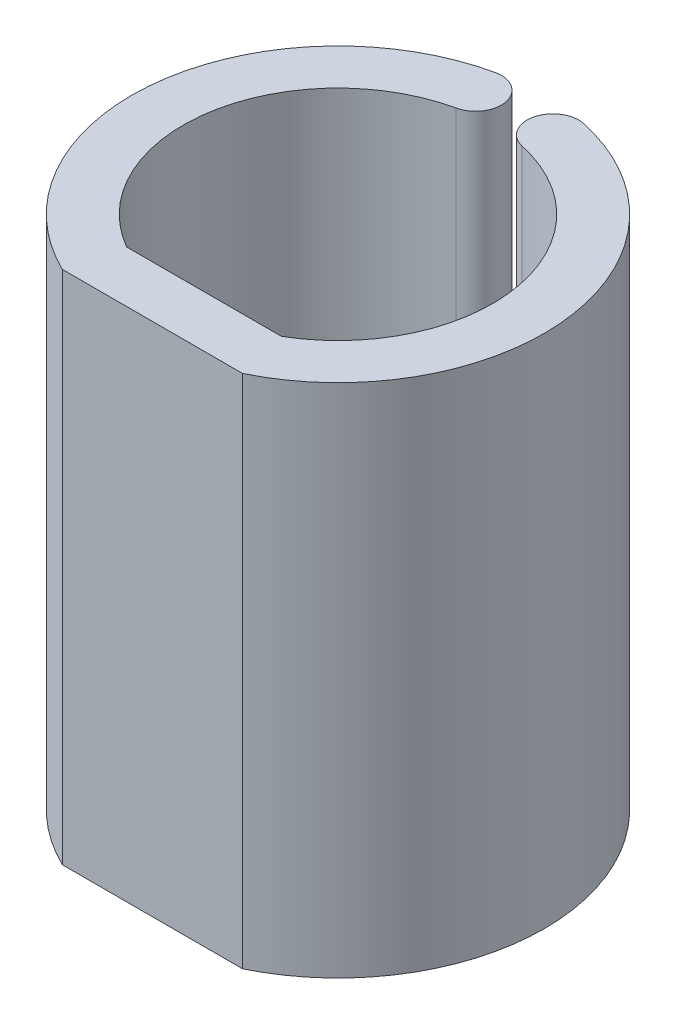
ISO-10303-21;
HEADER;
FILE_DESCRIPTION(('STEP AP214'),'2;1');
FILE_NAME('part.step','',(''),(''),'','','');
FILE_SCHEMA(('AUTOMOTIVE_DESIGN { 1 0 10303 214 1 1 1 1 }'));
ENDSEC;
DATA;
#1=APPLICATION_CONTEXT('core data for automotive mechanical design processes');
#2=APPLICATION_PROTOCOL_DEFINITION('international standard','automotive_design',2000,#1);
#3=PRODUCT_CONTEXT('',#1,'mechanical');
#4=PRODUCT('Part','Part','',(#3));
#5=PRODUCT_RELATED_PRODUCT_CATEGORY('part','',(#4));
#6=PRODUCT_DEFINITION_FORMATION('','',#4);
#7=PRODUCT_DEFINITION_CONTEXT('part definition',#1,'design');
#8=PRODUCT_DEFINITION('design','',#6,#7);
#9=PRODUCT_DEFINITION_SHAPE('','',#8);
#10=(LENGTH_UNIT() NAMED_UNIT(*) SI_UNIT(.MILLI.,.METRE.));
#11=(NAMED_UNIT(*) PLANE_ANGLE_UNIT() SI_UNIT($,.RADIAN.));
#12=(NAMED_UNIT(*) SI_UNIT($,.STERADIAN.) SOLID_ANGLE_UNIT());
#13=UNCERTAINTY_MEASURE_WITH_UNIT(LENGTH_MEASURE(1.E-05),#10,'distance_accuracy_value','');
#14=(GEOMETRIC_REPRESENTATION_CONTEXT(3) GLOBAL_UNCERTAINTY_ASSIGNED_CONTEXT((#13)) GLOBAL_UNIT_ASSIGNED_CONTEXT((#10,
#11,#12)) REPRESENTATION_CONTEXT('',''));
#15=CARTESIAN_POINT('',(0.,0.,0.));
#16=DIRECTION('',(0.,0.,1.));
#17=DIRECTION('',(1.,0.,0.));
#18=AXIS2_PLACEMENT_3D('',#15,#16,#17);
#19=CARTESIAN_POINT('',(0.,5.,-2.59807621135332));
#20=DIRECTION('',(0.,-1.,0.));
#21=DIRECTION('',(0.,0.,-1.));
#22=AXIS2_PLACEMENT_3D('',#19,#20,#21);
#23=CYLINDRICAL_SURFACE('',#22,3.);
#24=CARTESIAN_POINT('',(0.,-5.,-2.59807621135332));
#25=DIRECTION('',(0.,-1.,0.));
#26=DIRECTION('',(0.,0.,-1.));
#27=AXIS2_PLACEMENT_3D('',#24,#25,#26);
#28=CIRCLE('',#27,3.);
#29=CARTESIAN_POINT('',(-1.5,-5.,0.));
#30=VERTEX_POINT('',#29);
#31=CARTESIAN_POINT('',(-0.642857142857142,-5.,-5.52838928231989));
#32=VERTEX_POINT('',#31);
#33=EDGE_CURVE('E146',#30,#32,#28,.T.);
#34=ORIENTED_EDGE('',*,*,#33,.T.);
#35=DIRECTION('',(0.,-1.,0.));
#36=VECTOR('',#35,1.);
#37=CARTESIAN_POINT('',(-0.642857142857142,5.,-5.52838928231989));
#38=LINE('',#37,#36);
#39=CARTESIAN_POINT('',(-0.642857142857142,5.,-5.52838928231989));
#40=VERTEX_POINT('',#39);
#41=EDGE_CURVE('E11',#40,#32,#38,.T.);
#42=ORIENTED_EDGE('',*,*,#41,.F.);
#43=CARTESIAN_POINT('',(0.,5.,-2.59807621135332));
#44=DIRECTION('',(0.,-1.,0.));
#45=DIRECTION('',(0.,0.,-1.));
#46=AXIS2_PLACEMENT_3D('',#43,#44,#45);
#47=CIRCLE('',#46,3.);
#48=CARTESIAN_POINT('',(-1.5,5.,0.));
#49=VERTEX_POINT('',#48);
#50=EDGE_CURVE('E168',#49,#40,#47,.T.);
#51=ORIENTED_EDGE('',*,*,#50,.F.);
#52=DIRECTION('',(0.,-1.,0.));
#53=VECTOR('',#52,1.);
#54=CARTESIAN_POINT('',(-1.5,5.,0.));
#55=LINE('',#54,#53);
#56=EDGE_CURVE('E142',#49,#30,#55,.T.);
#57=ORIENTED_EDGE('',*,*,#56,.T.);
#58=EDGE_LOOP('',(#34,#42,#51,#57));
#59=FACE_BOUND('',#58,.T.);
#60=ADVANCED_FACE('F45',(#59),#23,.F.);
#61=CARTESIAN_POINT('',(-0.750000000000001,5.,-6.01677479414765));
#62=DIRECTION('',(0.,-1.,0.));
#63=DIRECTION('',(0.,0.,-1.));
#64=AXIS2_PLACEMENT_3D('',#61,#62,#63);
#65=CYLINDRICAL_SURFACE('',#64,0.5);
#66=CARTESIAN_POINT('',(-0.750000000000001,-5.,-6.01677479414765));
#67=DIRECTION('',(0.,1.,0.));
#68=DIRECTION('',(0.,0.,-1.));
#69=AXIS2_PLACEMENT_3D('',#66,#67,#68);
#70=CIRCLE('',#69,0.5);
#71=CARTESIAN_POINT('',(-0.857142857142859,-5.,-6.50516030597541));
#72=VERTEX_POINT('',#71);
#73=EDGE_CURVE('E150',#32,#72,#70,.T.);
#74=ORIENTED_EDGE('',*,*,#73,.T.);
#75=DIRECTION('',(0.,-1.,0.));
#76=VECTOR('',#75,1.);
#77=CARTESIAN_POINT('',(-0.857142857142859,5.,-6.50516030597541));
#78=LINE('',#77,#76);
#79=CARTESIAN_POINT('',(-0.857142857142859,5.,-6.50516030597541));
#80=VERTEX_POINT('',#79);
#81=EDGE_CURVE('E54',#80,#72,#78,.T.);
#82=ORIENTED_EDGE('',*,*,#81,.F.);
#83=CARTESIAN_POINT('',(-0.750000000000001,5.,-6.01677479414765));
#84=DIRECTION('',(0.,1.,0.));
#85=DIRECTION('',(0.,0.,-1.));
#86=AXIS2_PLACEMENT_3D('',#83,#84,#85);
#87=CIRCLE('',#86,0.5);
#88=EDGE_CURVE('E105',#40,#80,#87,.T.);
#89=ORIENTED_EDGE('',*,*,#88,.F.);
#90=ORIENTED_EDGE('',*,*,#41,.T.);
#91=EDGE_LOOP('',(#74,#82,#89,#90));
#92=FACE_BOUND('',#91,.T.);
#93=ADVANCED_FACE('F214',(#92),#65,.T.);
#94=CARTESIAN_POINT('',(0.,5.,-2.59807621135332));
#95=DIRECTION('',(0.,-1.,0.));
#96=DIRECTION('',(0.,0.,-1.));
#97=AXIS2_PLACEMENT_3D('',#94,#95,#96);
#98=CYLINDRICAL_SURFACE('',#97,4.);
#99=CARTESIAN_POINT('',(0.,-5.,-2.59807621135332));
#100=DIRECTION('',(0.,1.,0.));
#101=DIRECTION('',(0.,0.,-1.));
#102=AXIS2_PLACEMENT_3D('',#99,#100,#101);
#103=CIRCLE('',#102,4.);
#104=CARTESIAN_POINT('',(-1.7475261306468,-5.,1.));
#105=VERTEX_POINT('',#104);
#106=EDGE_CURVE('E153',#72,#105,#103,.T.);
#107=ORIENTED_EDGE('',*,*,#106,.T.);
#108=DIRECTION('',(0.,-1.,0.));
#109=VECTOR('',#108,1.);
#110=CARTESIAN_POINT('',(-1.7475261306468,5.,1.));
#111=LINE('',#110,#109);
#112=CARTESIAN_POINT('',(-1.7475261306468,5.,1.));
#113=VERTEX_POINT('',#112);
#114=EDGE_CURVE('E179',#113,#105,#111,.T.);
#115=ORIENTED_EDGE('',*,*,#114,.F.);
#116=CARTESIAN_POINT('',(0.,5.,-2.59807621135332));
#117=DIRECTION('',(0.,1.,0.));
#118=DIRECTION('',(0.,0.,-1.));
#119=AXIS2_PLACEMENT_3D('',#116,#117,#118);
#120=CIRCLE('',#119,4.);
#121=EDGE_CURVE('E189',#80,#113,#120,.T.);
#122=ORIENTED_EDGE('',*,*,#121,.F.);
#123=ORIENTED_EDGE('',*,*,#81,.T.);
#124=EDGE_LOOP('',(#107,#115,#122,#123));
#125=FACE_BOUND('',#124,.T.);
#126=ADVANCED_FACE('F187',(#125),#98,.T.);
#127=CARTESIAN_POINT('',(1.7475261306468,5.,1.));
#128=DIRECTION('',(0.,0.,-1.));
#129=DIRECTION('',(-1.,0.,0.));
#130=AXIS2_PLACEMENT_3D('',#127,#128,#129);
#131=PLANE('',#130);
#132=DIRECTION('',(1.,0.,0.));
#133=VECTOR('',#132,1.);
#134=CARTESIAN_POINT('',(1.7475261306468,-5.,1.));
#135=LINE('',#134,#133);
#136=CARTESIAN_POINT('',(1.7475261306468,-5.,1.));
#137=VERTEX_POINT('',#136);
#138=EDGE_CURVE('E156',#105,#137,#135,.T.);
#139=ORIENTED_EDGE('',*,*,#138,.T.);
#140=DIRECTION('',(0.,-1.,0.));
#141=VECTOR('',#140,1.);
#142=CARTESIAN_POINT('',(1.7475261306468,5.,1.));
#143=LINE('',#142,#141);
#144=CARTESIAN_POINT('',(1.7475261306468,5.,1.));
#145=VERTEX_POINT('',#144);
#146=EDGE_CURVE('E175',#145,#137,#143,.T.);
#147=ORIENTED_EDGE('',*,*,#146,.F.);
#148=DIRECTION('',(1.,0.,0.));
#149=VECTOR('',#148,1.);
#150=CARTESIAN_POINT('',(1.7475261306468,5.,1.));
#151=LINE('',#150,#149);
#152=EDGE_CURVE('E202',#113,#145,#151,.T.);
#153=ORIENTED_EDGE('',*,*,#152,.F.);
#154=ORIENTED_EDGE('',*,*,#114,.T.);
#155=EDGE_LOOP('',(#139,#147,#153,#154));
#156=FACE_BOUND('',#155,.T.);
#157=ADVANCED_FACE('F197',(#156),#131,.F.);
#158=CARTESIAN_POINT('',(0.,5.,-2.59807621135332));
#159=DIRECTION('',(0.,-1.,0.));
#160=DIRECTION('',(0.,0.,-1.));
#161=AXIS2_PLACEMENT_3D('',#158,#159,#160);
#162=CYLINDRICAL_SURFACE('',#161,4.);
#163=CARTESIAN_POINT('',(0.,-5.,-2.59807621135332));
#164=DIRECTION('',(0.,1.,0.));
#165=DIRECTION('',(0.,0.,1.));
#166=AXIS2_PLACEMENT_3D('',#163,#164,#165);
#167=CIRCLE('',#166,4.);
#168=CARTESIAN_POINT('',(0.857142857142856,-5.,-6.50516030597542));
#169=VERTEX_POINT('',#168);
#170=EDGE_CURVE('E159',#137,#169,#167,.T.);
#171=ORIENTED_EDGE('',*,*,#170,.T.);
#172=DIRECTION('',(0.,-1.,0.));
#173=VECTOR('',#172,1.);
#174=CARTESIAN_POINT('',(0.857142857142856,5.,-6.50516030597542));
#175=LINE('',#174,#173);
#176=CARTESIAN_POINT('',(0.857142857142856,5.,-6.50516030597542));
#177=VERTEX_POINT('',#176);
#178=EDGE_CURVE('E135',#177,#169,#175,.T.);
#179=ORIENTED_EDGE('',*,*,#178,.F.);
#180=CARTESIAN_POINT('',(0.,5.,-2.59807621135332));
#181=DIRECTION('',(0.,1.,0.));
#182=DIRECTION('',(0.,0.,1.));
#183=AXIS2_PLACEMENT_3D('',#180,#181,#182);
#184=CIRCLE('',#183,4.);
#185=EDGE_CURVE('E124',#145,#177,#184,.T.);
#186=ORIENTED_EDGE('',*,*,#185,.F.);
#187=ORIENTED_EDGE('',*,*,#146,.T.);
#188=EDGE_LOOP('',(#171,#179,#186,#187));
#189=FACE_BOUND('',#188,.T.);
#190=ADVANCED_FACE('F200',(#189),#162,.T.);
#191=CARTESIAN_POINT('',(0.749999999999999,5.,-6.01677479414765));
#192=DIRECTION('',(0.,-1.,0.));
#193=DIRECTION('',(0.,0.,-1.));
#194=AXIS2_PLACEMENT_3D('',#191,#192,#193);
#195=CYLINDRICAL_SURFACE('',#194,0.5);
#196=CARTESIAN_POINT('',(0.749999999999999,-5.,-6.01677479414765));
#197=DIRECTION('',(0.,1.,0.));
#198=DIRECTION('',(0.,0.,-1.));
#199=AXIS2_PLACEMENT_3D('',#196,#197,#198);
#200=CIRCLE('',#199,0.5);
#201=CARTESIAN_POINT('',(0.64285714285714,-5.,-5.52838928231989));
#202=VERTEX_POINT('',#201);
#203=EDGE_CURVE('E133',#169,#202,#200,.T.);
#204=ORIENTED_EDGE('',*,*,#203,.T.);
#205=DIRECTION('',(0.,-1.,0.));
#206=VECTOR('',#205,1.);
#207=CARTESIAN_POINT('',(0.64285714285714,5.,-5.52838928231989));
#208=LINE('',#207,#206);
#209=CARTESIAN_POINT('',(0.64285714285714,5.,-5.52838928231989));
#210=VERTEX_POINT('',#209);
#211=EDGE_CURVE('E130',#210,#202,#208,.T.);
#212=ORIENTED_EDGE('',*,*,#211,.F.);
#213=CARTESIAN_POINT('',(0.749999999999999,5.,-6.01677479414765));
#214=DIRECTION('',(0.,1.,0.));
#215=DIRECTION('',(0.,0.,-1.));
#216=AXIS2_PLACEMENT_3D('',#213,#214,#215);
#217=CIRCLE('',#216,0.5);
#218=EDGE_CURVE('E118',#177,#210,#217,.T.);
#219=ORIENTED_EDGE('',*,*,#218,.F.);
#220=ORIENTED_EDGE('',*,*,#178,.T.);
#221=EDGE_LOOP('',(#204,#212,#219,#220));
#222=FACE_BOUND('',#221,.T.);
#223=ADVANCED_FACE('F131',(#222),#195,.T.);
#224=CARTESIAN_POINT('',(0.,5.,-2.59807621135332));
#225=DIRECTION('',(0.,-1.,0.));
#226=DIRECTION('',(0.,0.,-1.));
#227=AXIS2_PLACEMENT_3D('',#224,#225,#226);
#228=CYLINDRICAL_SURFACE('',#227,3.);
#229=CARTESIAN_POINT('',(0.,-5.,-2.59807621135332));
#230=DIRECTION('',(0.,-1.,0.));
#231=DIRECTION('',(0.,0.,1.));
#232=AXIS2_PLACEMENT_3D('',#229,#230,#231);
#233=CIRCLE('',#232,3.);
#234=CARTESIAN_POINT('',(1.5,-5.,0.));
#235=VERTEX_POINT('',#234);
#236=EDGE_CURVE('E91',#202,#235,#233,.T.);
#237=ORIENTED_EDGE('',*,*,#236,.T.);
#238=DIRECTION('',(0.,-1.,0.));
#239=VECTOR('',#238,1.);
#240=CARTESIAN_POINT('',(1.5,5.,0.));
#241=LINE('',#240,#239);
#242=CARTESIAN_POINT('',(1.5,5.,0.));
#243=VERTEX_POINT('',#242);
#244=EDGE_CURVE('E136',#243,#235,#241,.T.);
#245=ORIENTED_EDGE('',*,*,#244,.F.);
#246=CARTESIAN_POINT('',(0.,5.,-2.59807621135332));
#247=DIRECTION('',(0.,-1.,0.));
#248=DIRECTION('',(0.,0.,1.));
#249=AXIS2_PLACEMENT_3D('',#246,#247,#248);
#250=CIRCLE('',#249,3.);
#251=EDGE_CURVE('E122',#210,#243,#250,.T.);
#252=ORIENTED_EDGE('',*,*,#251,.F.);
#253=ORIENTED_EDGE('',*,*,#211,.T.);
#254=EDGE_LOOP('',(#237,#245,#252,#253));
#255=FACE_BOUND('',#254,.T.);
#256=ADVANCED_FACE('F138',(#255),#228,.F.);
#257=CARTESIAN_POINT('',(1.5,5.,0.));
#258=DIRECTION('',(0.,0.,1.));
#259=DIRECTION('',(1.,0.,0.));
#260=AXIS2_PLACEMENT_3D('',#257,#258,#259);
#261=PLANE('',#260);
#262=DIRECTION('',(-1.,0.,0.));
#263=VECTOR('',#262,1.);
#264=CARTESIAN_POINT('',(1.5,-5.,0.));
#265=LINE('',#264,#263);
#266=EDGE_CURVE('E97',#235,#30,#265,.T.);
#267=ORIENTED_EDGE('',*,*,#266,.T.);
#268=ORIENTED_EDGE('',*,*,#56,.F.);
#269=DIRECTION('',(-1.,0.,0.));
#270=VECTOR('',#269,1.);
#271=CARTESIAN_POINT('',(1.5,5.,0.));
#272=LINE('',#271,#270);
#273=EDGE_CURVE('E62',#243,#49,#272,.T.);
#274=ORIENTED_EDGE('',*,*,#273,.F.);
#275=ORIENTED_EDGE('',*,*,#244,.T.);
#276=EDGE_LOOP('',(#267,#268,#274,#275));
#277=FACE_BOUND('',#276,.T.);
#278=ADVANCED_FACE('F230',(#277),#261,.F.);
#279=CARTESIAN_POINT('',(0.,5.,-2.59807621135332));
#280=DIRECTION('',(0.,-1.,0.));
#281=DIRECTION('',(0.,0.,-1.));
#282=AXIS2_PLACEMENT_3D('',#279,#280,#281);
#283=PLANE('',#282);
#284=ORIENTED_EDGE('',*,*,#50,.T.);
#285=ORIENTED_EDGE('',*,*,#88,.T.);
#286=ORIENTED_EDGE('',*,*,#121,.T.);
#287=ORIENTED_EDGE('',*,*,#152,.T.);
#288=ORIENTED_EDGE('',*,*,#185,.T.);
#289=ORIENTED_EDGE('',*,*,#218,.T.);
#290=ORIENTED_EDGE('',*,*,#251,.T.);
#291=ORIENTED_EDGE('',*,*,#273,.T.);
#292=EDGE_LOOP('',(#284,#285,#286,#287,#288,#289,#290,#291));
#293=FACE_BOUND('',#292,.T.);
#294=ADVANCED_FACE('F120',(#293),#283,.F.);
#295=CARTESIAN_POINT('',(0.,-5.,-2.59807621135332));
#296=DIRECTION('',(0.,-1.,0.));
#297=DIRECTION('',(0.,0.,-1.));
#298=AXIS2_PLACEMENT_3D('',#295,#296,#297);
#299=PLANE('',#298);
#300=ORIENTED_EDGE('',*,*,#33,.F.);
#301=ORIENTED_EDGE('',*,*,#266,.F.);
#302=ORIENTED_EDGE('',*,*,#236,.F.);
#303=ORIENTED_EDGE('',*,*,#203,.F.);
#304=ORIENTED_EDGE('',*,*,#170,.F.);
#305=ORIENTED_EDGE('',*,*,#138,.F.);
#306=ORIENTED_EDGE('',*,*,#106,.F.);
#307=ORIENTED_EDGE('',*,*,#73,.F.);
#308=EDGE_LOOP('',(#300,#301,#302,#303,#304,#305,#306,#307));
#309=FACE_BOUND('',#308,.T.);
#310=ADVANCED_FACE('F193',(#309),#299,.T.);
#311=CLOSED_SHELL('',(#60,#93,#126,#157,#190,#223,#256,#278,#294,#310));
#312=MANIFOLD_SOLID_BREP('B2',#311);
#313=ADVANCED_BREP_SHAPE_REPRESENTATION('',(#18,#312),#14);
#314=SHAPE_DEFINITION_REPRESENTATION(#9,#313);
ENDSEC;
END-ISO-10303-21;
